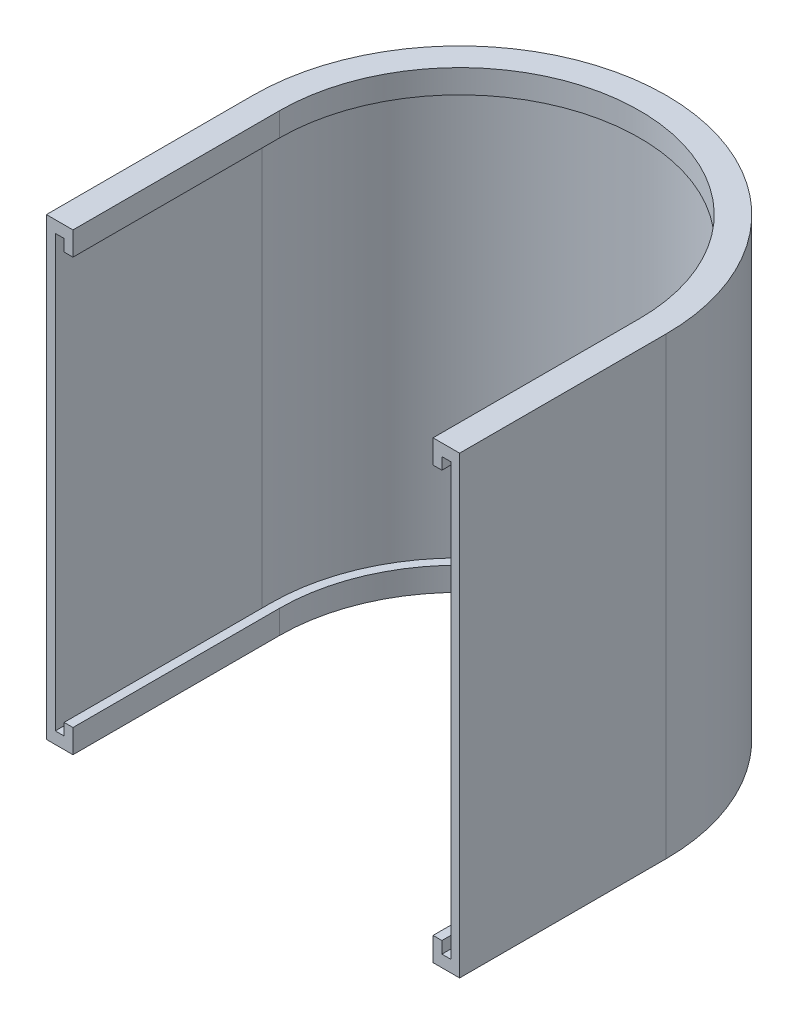
ISO-10303-21;
HEADER;
FILE_DESCRIPTION(('STEP AP214'),'2;1');
FILE_NAME('part.step','',(''),(''),'','','');
FILE_SCHEMA(('AUTOMOTIVE_DESIGN { 1 0 10303 214 1 1 1 1 }'));
ENDSEC;
DATA;
#1=APPLICATION_CONTEXT('core data for automotive mechanical design processes');
#2=APPLICATION_PROTOCOL_DEFINITION('international standard','automotive_design',2000,#1);
#3=PRODUCT_CONTEXT('',#1,'mechanical');
#4=PRODUCT('Part','Part','',(#3));
#5=PRODUCT_RELATED_PRODUCT_CATEGORY('part','',(#4));
#6=PRODUCT_DEFINITION_FORMATION('','',#4);
#7=PRODUCT_DEFINITION_CONTEXT('part definition',#1,'design');
#8=PRODUCT_DEFINITION('design','',#6,#7);
#9=PRODUCT_DEFINITION_SHAPE('','',#8);
#10=(LENGTH_UNIT() NAMED_UNIT(*) SI_UNIT(.MILLI.,.METRE.));
#11=(NAMED_UNIT(*) PLANE_ANGLE_UNIT() SI_UNIT($,.RADIAN.));
#12=(NAMED_UNIT(*) SI_UNIT($,.STERADIAN.) SOLID_ANGLE_UNIT());
#13=UNCERTAINTY_MEASURE_WITH_UNIT(LENGTH_MEASURE(1.E-05),#10,'distance_accuracy_value','');
#14=(GEOMETRIC_REPRESENTATION_CONTEXT(3) GLOBAL_UNCERTAINTY_ASSIGNED_CONTEXT((#13)) GLOBAL_UNIT_ASSIGNED_CONTEXT((#10,
#11,#12)) REPRESENTATION_CONTEXT('',''));
#15=CARTESIAN_POINT('',(0.,0.,0.));
#16=DIRECTION('',(0.,0.,1.));
#17=DIRECTION('',(1.,0.,0.));
#18=AXIS2_PLACEMENT_3D('',#15,#16,#17);
#19=CARTESIAN_POINT('',(-35.,2.,35.));
#20=DIRECTION('',(0.,0.,-1.));
#21=DIRECTION('',(-1.,0.,0.));
#22=AXIS2_PLACEMENT_3D('',#19,#20,#21);
#23=PLANE('',#22);
#24=DIRECTION('',(1.,0.,0.));
#25=VECTOR('',#24,1.);
#26=CARTESIAN_POINT('',(-35.,0.,35.));
#27=LINE('',#26,#25);
#28=CARTESIAN_POINT('',(-35.,0.,35.));
#29=VERTEX_POINT('',#28);
#30=CARTESIAN_POINT('',(-30.5,0.,35.));
#31=VERTEX_POINT('',#30);
#32=EDGE_CURVE('E373',#29,#31,#27,.T.);
#33=ORIENTED_EDGE('',*,*,#32,.T.);
#34=DIRECTION('',(0.,-1.,0.));
#35=VECTOR('',#34,1.);
#36=CARTESIAN_POINT('',(-30.5,4.,35.));
#37=LINE('',#36,#35);
#38=CARTESIAN_POINT('',(-30.5,4.,35.));
#39=VERTEX_POINT('',#38);
#40=EDGE_CURVE('E317',#39,#31,#37,.T.);
#41=ORIENTED_EDGE('',*,*,#40,.F.);
#42=DIRECTION('',(1.,0.,0.));
#43=VECTOR('',#42,1.);
#44=CARTESIAN_POINT('',(-32.,4.,35.));
#45=LINE('',#44,#43);
#46=CARTESIAN_POINT('',(-32.,4.,35.));
#47=VERTEX_POINT('',#46);
#48=EDGE_CURVE('E304',#47,#39,#45,.T.);
#49=ORIENTED_EDGE('',*,*,#48,.F.);
#50=DIRECTION('',(0.,-1.,0.));
#51=VECTOR('',#50,1.);
#52=CARTESIAN_POINT('',(-32.,4.,35.));
#53=LINE('',#52,#51);
#54=CARTESIAN_POINT('',(-32.,2.,35.));
#55=VERTEX_POINT('',#54);
#56=EDGE_CURVE('E319',#47,#55,#53,.T.);
#57=ORIENTED_EDGE('',*,*,#56,.T.);
#58=DIRECTION('',(1.,0.,0.));
#59=VECTOR('',#58,1.);
#60=CARTESIAN_POINT('',(-35.,2.,35.));
#61=LINE('',#60,#59);
#62=CARTESIAN_POINT('',(-33.5,2.,35.));
#63=VERTEX_POINT('',#62);
#64=EDGE_CURVE('E363',#63,#55,#61,.T.);
#65=ORIENTED_EDGE('',*,*,#64,.F.);
#66=DIRECTION('',(0.,-1.,0.));
#67=VECTOR('',#66,1.);
#68=CARTESIAN_POINT('',(-33.5,75.,35.));
#69=LINE('',#68,#67);
#70=CARTESIAN_POINT('',(-33.5,75.,35.));
#71=VERTEX_POINT('',#70);
#72=EDGE_CURVE('E353',#71,#63,#69,.T.);
#73=ORIENTED_EDGE('',*,*,#72,.F.);
#74=DIRECTION('',(1.,0.,0.));
#75=VECTOR('',#74,1.);
#76=CARTESIAN_POINT('',(-35.,75.,35.));
#77=LINE('',#76,#75);
#78=CARTESIAN_POINT('',(-32.,75.,35.));
#79=VERTEX_POINT('',#78);
#80=EDGE_CURVE('E280',#71,#79,#77,.T.);
#81=ORIENTED_EDGE('',*,*,#80,.T.);
#82=DIRECTION('',(0.,1.,0.));
#83=VECTOR('',#82,1.);
#84=CARTESIAN_POINT('',(-32.,73.,35.));
#85=LINE('',#84,#83);
#86=CARTESIAN_POINT('',(-32.,73.,35.));
#87=VERTEX_POINT('',#86);
#88=EDGE_CURVE('E262',#87,#79,#85,.T.);
#89=ORIENTED_EDGE('',*,*,#88,.F.);
#90=DIRECTION('',(-1.,0.,0.));
#91=VECTOR('',#90,1.);
#92=CARTESIAN_POINT('',(-32.,73.,35.));
#93=LINE('',#92,#91);
#94=CARTESIAN_POINT('',(-30.5,73.,35.));
#95=VERTEX_POINT('',#94);
#96=EDGE_CURVE('E248',#95,#87,#93,.T.);
#97=ORIENTED_EDGE('',*,*,#96,.F.);
#98=DIRECTION('',(0.,1.,0.));
#99=VECTOR('',#98,1.);
#100=CARTESIAN_POINT('',(-30.5,73.,35.));
#101=LINE('',#100,#99);
#102=CARTESIAN_POINT('',(-30.5,77.,35.));
#103=VERTEX_POINT('',#102);
#104=EDGE_CURVE('E265',#95,#103,#101,.T.);
#105=ORIENTED_EDGE('',*,*,#104,.T.);
#106=DIRECTION('',(1.,0.,0.));
#107=VECTOR('',#106,1.);
#108=CARTESIAN_POINT('',(-35.,77.,35.));
#109=LINE('',#108,#107);
#110=CARTESIAN_POINT('',(-35.,77.,35.));
#111=VERTEX_POINT('',#110);
#112=EDGE_CURVE('E284',#111,#103,#109,.T.);
#113=ORIENTED_EDGE('',*,*,#112,.F.);
#114=DIRECTION('',(0.,-1.,0.));
#115=VECTOR('',#114,1.);
#116=CARTESIAN_POINT('',(-35.,2.,35.));
#117=LINE('',#116,#115);
#118=EDGE_CURVE('E46',#111,#29,#117,.T.);
#119=ORIENTED_EDGE('',*,*,#118,.T.);
#120=EDGE_LOOP('',(#33,#41,#49,#57,#65,#73,#81,#89,#97,#105,#113,#119));
#121=FACE_BOUND('',#120,.T.);
#122=ADVANCED_FACE('F38',(#121),#23,.F.);
#123=CARTESIAN_POINT('',(0.,75.,0.));
#124=DIRECTION('',(0.,1.,0.));
#125=DIRECTION('',(0.,0.,1.));
#126=AXIS2_PLACEMENT_3D('',#123,#124,#125);
#127=PLANE('',#126);
#128=DIRECTION('',(0.,0.,1.));
#129=VECTOR('',#128,1.);
#130=CARTESIAN_POINT('',(32.,75.,0.));
#131=LINE('',#130,#129);
#132=CARTESIAN_POINT('',(32.,75.,0.));
#133=VERTEX_POINT('',#132);
#134=CARTESIAN_POINT('',(32.,75.,35.));
#135=VERTEX_POINT('',#134);
#136=EDGE_CURVE('E255',#133,#135,#131,.T.);
#137=ORIENTED_EDGE('',*,*,#136,.F.);
#138=CARTESIAN_POINT('',(0.,75.,0.));
#139=DIRECTION('',(0.,-1.,0.));
#140=DIRECTION('',(0.,0.,-1.));
#141=AXIS2_PLACEMENT_3D('',#138,#139,#140);
#142=CIRCLE('',#141,32.);
#143=CARTESIAN_POINT('',(-32.,75.,0.));
#144=VERTEX_POINT('',#143);
#145=EDGE_CURVE('E234',#144,#133,#142,.T.);
#146=ORIENTED_EDGE('',*,*,#145,.F.);
#147=DIRECTION('',(0.,0.,-1.));
#148=VECTOR('',#147,1.);
#149=CARTESIAN_POINT('',(-32.,75.,0.));
#150=LINE('',#149,#148);
#151=EDGE_CURVE('E239',#79,#144,#150,.T.);
#152=ORIENTED_EDGE('',*,*,#151,.F.);
#153=ORIENTED_EDGE('',*,*,#80,.F.);
#154=DIRECTION('',(0.,0.,-1.));
#155=VECTOR('',#154,1.);
#156=CARTESIAN_POINT('',(-33.5,75.,0.));
#157=LINE('',#156,#155);
#158=CARTESIAN_POINT('',(-33.5,75.,0.));
#159=VERTEX_POINT('',#158);
#160=EDGE_CURVE('E340',#71,#159,#157,.T.);
#161=ORIENTED_EDGE('',*,*,#160,.T.);
#162=CARTESIAN_POINT('',(0.,75.,0.));
#163=DIRECTION('',(0.,-1.,0.));
#164=DIRECTION('',(0.,0.,1.));
#165=AXIS2_PLACEMENT_3D('',#162,#163,#164);
#166=CIRCLE('',#165,33.5);
#167=CARTESIAN_POINT('',(33.5,75.,0.));
#168=VERTEX_POINT('',#167);
#169=EDGE_CURVE('E333',#159,#168,#166,.T.);
#170=ORIENTED_EDGE('',*,*,#169,.T.);
#171=DIRECTION('',(0.,0.,1.));
#172=VECTOR('',#171,1.);
#173=CARTESIAN_POINT('',(33.5,75.,0.));
#174=LINE('',#173,#172);
#175=CARTESIAN_POINT('',(33.5,75.,35.));
#176=VERTEX_POINT('',#175);
#177=EDGE_CURVE('E336',#168,#176,#174,.T.);
#178=ORIENTED_EDGE('',*,*,#177,.T.);
#179=EDGE_CURVE('E275',#135,#176,#77,.T.);
#180=ORIENTED_EDGE('',*,*,#179,.F.);
#181=EDGE_LOOP('',(#137,#146,#152,#153,#161,#170,#178,#180));
#182=FACE_BOUND('',#181,.T.);
#183=ADVANCED_FACE('F419',(#182),#127,.F.);
#184=CARTESIAN_POINT('',(0.,2.,0.));
#185=DIRECTION('',(0.,1.,0.));
#186=DIRECTION('',(0.,0.,1.));
#187=AXIS2_PLACEMENT_3D('',#184,#185,#186);
#188=PLANE('',#187);
#189=CARTESIAN_POINT('',(0.,2.,0.));
#190=DIRECTION('',(0.,1.,0.));
#191=DIRECTION('',(0.,0.,1.));
#192=AXIS2_PLACEMENT_3D('',#189,#190,#191);
#193=CIRCLE('',#192,32.);
#194=CARTESIAN_POINT('',(32.,2.,0.));
#195=VERTEX_POINT('',#194);
#196=CARTESIAN_POINT('',(-32.,2.,0.));
#197=VERTEX_POINT('',#196);
#198=EDGE_CURVE('E311',#195,#197,#193,.T.);
#199=ORIENTED_EDGE('',*,*,#198,.F.);
#200=DIRECTION('',(0.,0.,-1.));
#201=VECTOR('',#200,1.);
#202=CARTESIAN_POINT('',(32.,2.,0.));
#203=LINE('',#202,#201);
#204=CARTESIAN_POINT('',(32.,2.,35.));
#205=VERTEX_POINT('',#204);
#206=EDGE_CURVE('E289',#205,#195,#203,.T.);
#207=ORIENTED_EDGE('',*,*,#206,.F.);
#208=CARTESIAN_POINT('',(33.5,2.,35.));
#209=VERTEX_POINT('',#208);
#210=EDGE_CURVE('E367',#205,#209,#61,.T.);
#211=ORIENTED_EDGE('',*,*,#210,.T.);
#212=DIRECTION('',(0.,0.,1.));
#213=VECTOR('',#212,1.);
#214=CARTESIAN_POINT('',(33.5,2.,0.));
#215=LINE('',#214,#213);
#216=CARTESIAN_POINT('',(33.5,2.,0.));
#217=VERTEX_POINT('',#216);
#218=EDGE_CURVE('E346',#217,#209,#215,.T.);
#219=ORIENTED_EDGE('',*,*,#218,.F.);
#220=CARTESIAN_POINT('',(0.,2.,0.));
#221=DIRECTION('',(0.,-1.,0.));
#222=DIRECTION('',(0.,0.,1.));
#223=AXIS2_PLACEMENT_3D('',#220,#221,#222);
#224=CIRCLE('',#223,33.5);
#225=CARTESIAN_POINT('',(-33.5,2.,0.));
#226=VERTEX_POINT('',#225);
#227=EDGE_CURVE('E332',#226,#217,#224,.T.);
#228=ORIENTED_EDGE('',*,*,#227,.F.);
#229=DIRECTION('',(0.,0.,-1.));
#230=VECTOR('',#229,1.);
#231=CARTESIAN_POINT('',(-33.5,2.,0.));
#232=LINE('',#231,#230);
#233=EDGE_CURVE('E337',#63,#226,#232,.T.);
#234=ORIENTED_EDGE('',*,*,#233,.F.);
#235=ORIENTED_EDGE('',*,*,#64,.T.);
#236=DIRECTION('',(0.,0.,1.));
#237=VECTOR('',#236,1.);
#238=CARTESIAN_POINT('',(-32.,2.,0.));
#239=LINE('',#238,#237);
#240=EDGE_CURVE('E296',#197,#55,#239,.T.);
#241=ORIENTED_EDGE('',*,*,#240,.F.);
#242=EDGE_LOOP('',(#199,#207,#211,#219,#228,#234,#235,#241));
#243=FACE_BOUND('',#242,.T.);
#244=ADVANCED_FACE('F411',(#243),#188,.T.);
#245=CARTESIAN_POINT('',(0.,2.,0.));
#246=DIRECTION('',(0.,-1.,0.));
#247=DIRECTION('',(0.,0.,-1.));
#248=AXIS2_PLACEMENT_3D('',#245,#246,#247);
#249=CYLINDRICAL_SURFACE('',#248,35.);
#250=CARTESIAN_POINT('',(0.,0.,0.));
#251=DIRECTION('',(0.,1.,0.));
#252=DIRECTION('',(0.,0.,1.));
#253=AXIS2_PLACEMENT_3D('',#250,#251,#252);
#254=CIRCLE('',#253,35.);
#255=CARTESIAN_POINT('',(35.,0.,0.));
#256=VERTEX_POINT('',#255);
#257=CARTESIAN_POINT('',(-35.,0.,0.));
#258=VERTEX_POINT('',#257);
#259=EDGE_CURVE('E362',#256,#258,#254,.T.);
#260=ORIENTED_EDGE('',*,*,#259,.T.);
#261=DIRECTION('',(0.,-1.,0.));
#262=VECTOR('',#261,1.);
#263=CARTESIAN_POINT('',(-35.,2.,0.));
#264=LINE('',#263,#262);
#265=CARTESIAN_POINT('',(-35.,77.,0.));
#266=VERTEX_POINT('',#265);
#267=EDGE_CURVE('E11',#266,#258,#264,.T.);
#268=ORIENTED_EDGE('',*,*,#267,.F.);
#269=CARTESIAN_POINT('',(0.,77.,0.));
#270=DIRECTION('',(0.,1.,0.));
#271=DIRECTION('',(0.,0.,1.));
#272=AXIS2_PLACEMENT_3D('',#269,#270,#271);
#273=CIRCLE('',#272,35.);
#274=CARTESIAN_POINT('',(35.,77.,0.));
#275=VERTEX_POINT('',#274);
#276=EDGE_CURVE('E276',#275,#266,#273,.T.);
#277=ORIENTED_EDGE('',*,*,#276,.F.);
#278=DIRECTION('',(0.,-1.,0.));
#279=VECTOR('',#278,1.);
#280=CARTESIAN_POINT('',(35.,2.,0.));
#281=LINE('',#280,#279);
#282=EDGE_CURVE('E366',#275,#256,#281,.T.);
#283=ORIENTED_EDGE('',*,*,#282,.T.);
#284=EDGE_LOOP('',(#260,#268,#277,#283));
#285=FACE_BOUND('',#284,.T.);
#286=ADVANCED_FACE('F40',(#285),#249,.T.);
#287=CARTESIAN_POINT('',(-35.,2.,0.));
#288=DIRECTION('',(1.,0.,0.));
#289=DIRECTION('',(0.,0.,-1.));
#290=AXIS2_PLACEMENT_3D('',#287,#288,#289);
#291=PLANE('',#290);
#292=DIRECTION('',(0.,0.,1.));
#293=VECTOR('',#292,1.);
#294=CARTESIAN_POINT('',(-35.,0.,0.));
#295=LINE('',#294,#293);
#296=EDGE_CURVE('E370',#258,#29,#295,.T.);
#297=ORIENTED_EDGE('',*,*,#296,.T.);
#298=ORIENTED_EDGE('',*,*,#118,.F.);
#299=DIRECTION('',(0.,0.,1.));
#300=VECTOR('',#299,1.);
#301=CARTESIAN_POINT('',(-35.,77.,0.));
#302=LINE('',#301,#300);
#303=EDGE_CURVE('E279',#266,#111,#302,.T.);
#304=ORIENTED_EDGE('',*,*,#303,.F.);
#305=ORIENTED_EDGE('',*,*,#267,.T.);
#306=EDGE_LOOP('',(#297,#298,#304,#305));
#307=FACE_BOUND('',#306,.T.);
#308=ADVANCED_FACE('F435',(#307),#291,.F.);
#309=CARTESIAN_POINT('',(30.5,77.,35.));
#310=VERTEX_POINT('',#309);
#311=CARTESIAN_POINT('',(35.,77.,35.));
#312=VERTEX_POINT('',#311);
#313=EDGE_CURVE('E283',#310,#312,#109,.T.);
#314=ORIENTED_EDGE('',*,*,#313,.F.);
#315=DIRECTION('',(0.,1.,0.));
#316=VECTOR('',#315,1.);
#317=CARTESIAN_POINT('',(30.5,73.,35.));
#318=LINE('',#317,#316);
#319=CARTESIAN_POINT('',(30.5,73.,35.));
#320=VERTEX_POINT('',#319);
#321=EDGE_CURVE('E61',#320,#310,#318,.T.);
#322=ORIENTED_EDGE('',*,*,#321,.F.);
#323=DIRECTION('',(-1.,0.,0.));
#324=VECTOR('',#323,1.);
#325=CARTESIAN_POINT('',(30.5,73.,35.));
#326=LINE('',#325,#324);
#327=CARTESIAN_POINT('',(32.,73.,35.));
#328=VERTEX_POINT('',#327);
#329=EDGE_CURVE('E241',#328,#320,#326,.T.);
#330=ORIENTED_EDGE('',*,*,#329,.F.);
#331=DIRECTION('',(0.,1.,0.));
#332=VECTOR('',#331,1.);
#333=CARTESIAN_POINT('',(32.,73.,35.));
#334=LINE('',#333,#332);
#335=EDGE_CURVE('E269',#328,#135,#334,.T.);
#336=ORIENTED_EDGE('',*,*,#335,.T.);
#337=ORIENTED_EDGE('',*,*,#179,.T.);
#338=DIRECTION('',(0.,-1.,0.));
#339=VECTOR('',#338,1.);
#340=CARTESIAN_POINT('',(33.5,75.,35.));
#341=LINE('',#340,#339);
#342=EDGE_CURVE('E356',#176,#209,#341,.T.);
#343=ORIENTED_EDGE('',*,*,#342,.T.);
#344=ORIENTED_EDGE('',*,*,#210,.F.);
#345=DIRECTION('',(0.,-1.,0.));
#346=VECTOR('',#345,1.);
#347=CARTESIAN_POINT('',(32.,4.,35.));
#348=LINE('',#347,#346);
#349=CARTESIAN_POINT('',(32.,4.,35.));
#350=VERTEX_POINT('',#349);
#351=EDGE_CURVE('E328',#350,#205,#348,.T.);
#352=ORIENTED_EDGE('',*,*,#351,.F.);
#353=DIRECTION('',(1.,0.,0.));
#354=VECTOR('',#353,1.);
#355=CARTESIAN_POINT('',(30.5,4.,35.));
#356=LINE('',#355,#354);
#357=CARTESIAN_POINT('',(30.5,4.,35.));
#358=VERTEX_POINT('',#357);
#359=EDGE_CURVE('E295',#358,#350,#356,.T.);
#360=ORIENTED_EDGE('',*,*,#359,.F.);
#361=DIRECTION('',(0.,-1.,0.));
#362=VECTOR('',#361,1.);
#363=CARTESIAN_POINT('',(30.5,4.,35.));
#364=LINE('',#363,#362);
#365=CARTESIAN_POINT('',(30.5,0.,35.));
#366=VERTEX_POINT('',#365);
#367=EDGE_CURVE('E330',#358,#366,#364,.T.);
#368=ORIENTED_EDGE('',*,*,#367,.T.);
#369=CARTESIAN_POINT('',(35.,0.,35.));
#370=VERTEX_POINT('',#369);
#371=EDGE_CURVE('E372',#366,#370,#27,.T.);
#372=ORIENTED_EDGE('',*,*,#371,.T.);
#373=DIRECTION('',(0.,-1.,0.));
#374=VECTOR('',#373,1.);
#375=CARTESIAN_POINT('',(35.,2.,35.));
#376=LINE('',#375,#374);
#377=EDGE_CURVE('E380',#312,#370,#376,.T.);
#378=ORIENTED_EDGE('',*,*,#377,.F.);
#379=EDGE_LOOP('',(#314,#322,#330,#336,#337,#343,#344,#352,#360,#368,#372,#378));
#380=FACE_BOUND('',#379,.T.);
#381=ADVANCED_FACE('F444',(#380),#23,.F.);
#382=CARTESIAN_POINT('',(35.,2.,0.));
#383=DIRECTION('',(-1.,0.,0.));
#384=DIRECTION('',(0.,0.,1.));
#385=AXIS2_PLACEMENT_3D('',#382,#383,#384);
#386=PLANE('',#385);
#387=DIRECTION('',(0.,0.,-1.));
#388=VECTOR('',#387,1.);
#389=CARTESIAN_POINT('',(35.,0.,0.));
#390=LINE('',#389,#388);
#391=EDGE_CURVE('E376',#370,#256,#390,.T.);
#392=ORIENTED_EDGE('',*,*,#391,.T.);
#393=ORIENTED_EDGE('',*,*,#282,.F.);
#394=DIRECTION('',(0.,0.,-1.));
#395=VECTOR('',#394,1.);
#396=CARTESIAN_POINT('',(35.,77.,0.));
#397=LINE('',#396,#395);
#398=EDGE_CURVE('E286',#312,#275,#397,.T.);
#399=ORIENTED_EDGE('',*,*,#398,.F.);
#400=ORIENTED_EDGE('',*,*,#377,.T.);
#401=EDGE_LOOP('',(#392,#393,#399,#400));
#402=FACE_BOUND('',#401,.T.);
#403=ADVANCED_FACE('F440',(#402),#386,.F.);
#404=CARTESIAN_POINT('',(0.,0.,0.));
#405=DIRECTION('',(0.,1.,0.));
#406=DIRECTION('',(0.,0.,1.));
#407=AXIS2_PLACEMENT_3D('',#404,#405,#406);
#408=PLANE('',#407);
#409=CARTESIAN_POINT('',(0.,0.,0.));
#410=DIRECTION('',(0.,1.,0.));
#411=DIRECTION('',(0.,0.,1.));
#412=AXIS2_PLACEMENT_3D('',#409,#410,#411);
#413=CIRCLE('',#412,30.5);
#414=CARTESIAN_POINT('',(30.5,0.,0.));
#415=VERTEX_POINT('',#414);
#416=CARTESIAN_POINT('',(-30.5,0.,0.));
#417=VERTEX_POINT('',#416);
#418=EDGE_CURVE('E228',#415,#417,#413,.T.);
#419=ORIENTED_EDGE('',*,*,#418,.T.);
#420=DIRECTION('',(0.,0.,1.));
#421=VECTOR('',#420,1.);
#422=CARTESIAN_POINT('',(-30.5,0.,0.));
#423=LINE('',#422,#421);
#424=EDGE_CURVE('E231',#417,#31,#423,.T.);
#425=ORIENTED_EDGE('',*,*,#424,.T.);
#426=ORIENTED_EDGE('',*,*,#32,.F.);
#427=ORIENTED_EDGE('',*,*,#296,.F.);
#428=ORIENTED_EDGE('',*,*,#259,.F.);
#429=ORIENTED_EDGE('',*,*,#391,.F.);
#430=ORIENTED_EDGE('',*,*,#371,.F.);
#431=DIRECTION('',(0.,0.,-1.));
#432=VECTOR('',#431,1.);
#433=CARTESIAN_POINT('',(30.5,0.,0.));
#434=LINE('',#433,#432);
#435=EDGE_CURVE('E223',#366,#415,#434,.T.);
#436=ORIENTED_EDGE('',*,*,#435,.T.);
#437=EDGE_LOOP('',(#419,#425,#426,#427,#428,#429,#430,#436));
#438=FACE_BOUND('',#437,.T.);
#439=ADVANCED_FACE('F390',(#438),#408,.F.);
#440=CARTESIAN_POINT('',(0.,75.,0.));
#441=DIRECTION('',(0.,-1.,0.));
#442=DIRECTION('',(0.,0.,-1.));
#443=AXIS2_PLACEMENT_3D('',#440,#441,#442);
#444=CYLINDRICAL_SURFACE('',#443,33.5);
#445=ORIENTED_EDGE('',*,*,#227,.T.);
#446=DIRECTION('',(0.,-1.,0.));
#447=VECTOR('',#446,1.);
#448=CARTESIAN_POINT('',(33.5,75.,0.));
#449=LINE('',#448,#447);
#450=EDGE_CURVE('E359',#168,#217,#449,.T.);
#451=ORIENTED_EDGE('',*,*,#450,.F.);
#452=ORIENTED_EDGE('',*,*,#169,.F.);
#453=DIRECTION('',(0.,-1.,0.));
#454=VECTOR('',#453,1.);
#455=CARTESIAN_POINT('',(-33.5,75.,0.));
#456=LINE('',#455,#454);
#457=EDGE_CURVE('E343',#159,#226,#456,.T.);
#458=ORIENTED_EDGE('',*,*,#457,.T.);
#459=EDGE_LOOP('',(#445,#451,#452,#458));
#460=FACE_BOUND('',#459,.T.);
#461=ADVANCED_FACE('F483',(#460),#444,.F.);
#462=CARTESIAN_POINT('',(33.5,75.,0.));
#463=DIRECTION('',(1.,0.,0.));
#464=DIRECTION('',(0.,0.,-1.));
#465=AXIS2_PLACEMENT_3D('',#462,#463,#464);
#466=PLANE('',#465);
#467=ORIENTED_EDGE('',*,*,#218,.T.);
#468=ORIENTED_EDGE('',*,*,#342,.F.);
#469=ORIENTED_EDGE('',*,*,#177,.F.);
#470=ORIENTED_EDGE('',*,*,#450,.T.);
#471=EDGE_LOOP('',(#467,#468,#469,#470));
#472=FACE_BOUND('',#471,.T.);
#473=ADVANCED_FACE('F458',(#472),#466,.F.);
#474=CARTESIAN_POINT('',(-33.5,75.,0.));
#475=DIRECTION('',(-1.,0.,0.));
#476=DIRECTION('',(0.,0.,1.));
#477=AXIS2_PLACEMENT_3D('',#474,#475,#476);
#478=PLANE('',#477);
#479=ORIENTED_EDGE('',*,*,#233,.T.);
#480=ORIENTED_EDGE('',*,*,#457,.F.);
#481=ORIENTED_EDGE('',*,*,#160,.F.);
#482=ORIENTED_EDGE('',*,*,#72,.T.);
#483=EDGE_LOOP('',(#479,#480,#481,#482));
#484=FACE_BOUND('',#483,.T.);
#485=ADVANCED_FACE('F415',(#484),#478,.F.);
#486=CARTESIAN_POINT('',(30.5,4.,0.));
#487=DIRECTION('',(1.,0.,0.));
#488=DIRECTION('',(0.,0.,-1.));
#489=AXIS2_PLACEMENT_3D('',#486,#487,#488);
#490=PLANE('',#489);
#491=DIRECTION('',(0.,-1.,0.));
#492=VECTOR('',#491,1.);
#493=CARTESIAN_POINT('',(30.5,4.,0.));
#494=LINE('',#493,#492);
#495=CARTESIAN_POINT('',(30.5,4.,0.));
#496=VERTEX_POINT('',#495);
#497=EDGE_CURVE('E53',#496,#415,#494,.T.);
#498=ORIENTED_EDGE('',*,*,#497,.T.);
#499=ORIENTED_EDGE('',*,*,#435,.F.);
#500=ORIENTED_EDGE('',*,*,#367,.F.);
#501=DIRECTION('',(0.,0.,1.));
#502=VECTOR('',#501,1.);
#503=CARTESIAN_POINT('',(30.5,4.,0.));
#504=LINE('',#503,#502);
#505=EDGE_CURVE('E292',#496,#358,#504,.T.);
#506=ORIENTED_EDGE('',*,*,#505,.F.);
#507=EDGE_LOOP('',(#498,#499,#500,#506));
#508=FACE_BOUND('',#507,.T.);
#509=ADVANCED_FACE('F447',(#508),#490,.F.);
#510=CARTESIAN_POINT('',(32.,4.,0.));
#511=DIRECTION('',(-1.,0.,0.));
#512=DIRECTION('',(0.,0.,1.));
#513=AXIS2_PLACEMENT_3D('',#510,#511,#512);
#514=PLANE('',#513);
#515=ORIENTED_EDGE('',*,*,#206,.T.);
#516=DIRECTION('',(0.,-1.,0.));
#517=VECTOR('',#516,1.);
#518=CARTESIAN_POINT('',(32.,4.,0.));
#519=LINE('',#518,#517);
#520=CARTESIAN_POINT('',(32.,4.,0.));
#521=VERTEX_POINT('',#520);
#522=EDGE_CURVE('E325',#521,#195,#519,.T.);
#523=ORIENTED_EDGE('',*,*,#522,.F.);
#524=DIRECTION('',(0.,0.,-1.));
#525=VECTOR('',#524,1.);
#526=CARTESIAN_POINT('',(32.,4.,0.));
#527=LINE('',#526,#525);
#528=EDGE_CURVE('E298',#350,#521,#527,.T.);
#529=ORIENTED_EDGE('',*,*,#528,.F.);
#530=ORIENTED_EDGE('',*,*,#351,.T.);
#531=EDGE_LOOP('',(#515,#523,#529,#530));
#532=FACE_BOUND('',#531,.T.);
#533=ADVANCED_FACE('F449',(#532),#514,.F.);
#534=CARTESIAN_POINT('',(0.,4.,0.));
#535=DIRECTION('',(0.,-1.,0.));
#536=DIRECTION('',(0.,0.,-1.));
#537=AXIS2_PLACEMENT_3D('',#534,#535,#536);
#538=CYLINDRICAL_SURFACE('',#537,32.);
#539=ORIENTED_EDGE('',*,*,#198,.T.);
#540=DIRECTION('',(0.,-1.,0.));
#541=VECTOR('',#540,1.);
#542=CARTESIAN_POINT('',(-32.,4.,0.));
#543=LINE('',#542,#541);
#544=CARTESIAN_POINT('',(-32.,4.,0.));
#545=VERTEX_POINT('',#544);
#546=EDGE_CURVE('E322',#545,#197,#543,.T.);
#547=ORIENTED_EDGE('',*,*,#546,.F.);
#548=CARTESIAN_POINT('',(0.,4.,0.));
#549=DIRECTION('',(0.,1.,0.));
#550=DIRECTION('',(0.,0.,1.));
#551=AXIS2_PLACEMENT_3D('',#548,#549,#550);
#552=CIRCLE('',#551,32.);
#553=EDGE_CURVE('E300',#521,#545,#552,.T.);
#554=ORIENTED_EDGE('',*,*,#553,.F.);
#555=ORIENTED_EDGE('',*,*,#522,.T.);
#556=EDGE_LOOP('',(#539,#547,#554,#555));
#557=FACE_BOUND('',#556,.T.);
#558=ADVANCED_FACE('F455',(#557),#538,.T.);
#559=CARTESIAN_POINT('',(-32.,4.,0.));
#560=DIRECTION('',(1.,0.,0.));
#561=DIRECTION('',(0.,0.,-1.));
#562=AXIS2_PLACEMENT_3D('',#559,#560,#561);
#563=PLANE('',#562);
#564=ORIENTED_EDGE('',*,*,#240,.T.);
#565=ORIENTED_EDGE('',*,*,#56,.F.);
#566=DIRECTION('',(0.,0.,1.));
#567=VECTOR('',#566,1.);
#568=CARTESIAN_POINT('',(-32.,4.,0.));
#569=LINE('',#568,#567);
#570=EDGE_CURVE('E302',#545,#47,#569,.T.);
#571=ORIENTED_EDGE('',*,*,#570,.F.);
#572=ORIENTED_EDGE('',*,*,#546,.T.);
#573=EDGE_LOOP('',(#564,#565,#571,#572));
#574=FACE_BOUND('',#573,.T.);
#575=ADVANCED_FACE('F407',(#574),#563,.F.);
#576=CARTESIAN_POINT('',(-30.5,4.,0.));
#577=DIRECTION('',(-1.,0.,0.));
#578=DIRECTION('',(0.,0.,1.));
#579=AXIS2_PLACEMENT_3D('',#576,#577,#578);
#580=PLANE('',#579);
#581=ORIENTED_EDGE('',*,*,#40,.T.);
#582=ORIENTED_EDGE('',*,*,#424,.F.);
#583=DIRECTION('',(0.,-1.,0.));
#584=VECTOR('',#583,1.);
#585=CARTESIAN_POINT('',(-30.5,4.,0.));
#586=LINE('',#585,#584);
#587=CARTESIAN_POINT('',(-30.5,4.,0.));
#588=VERTEX_POINT('',#587);
#589=EDGE_CURVE('E315',#588,#417,#586,.T.);
#590=ORIENTED_EDGE('',*,*,#589,.F.);
#591=DIRECTION('',(0.,0.,-1.));
#592=VECTOR('',#591,1.);
#593=CARTESIAN_POINT('',(-30.5,4.,0.));
#594=LINE('',#593,#592);
#595=EDGE_CURVE('E306',#39,#588,#594,.T.);
#596=ORIENTED_EDGE('',*,*,#595,.F.);
#597=EDGE_LOOP('',(#581,#582,#590,#596));
#598=FACE_BOUND('',#597,.T.);
#599=ADVANCED_FACE('F395',(#598),#580,.F.);
#600=CARTESIAN_POINT('',(0.,4.,0.));
#601=DIRECTION('',(0.,-1.,0.));
#602=DIRECTION('',(0.,0.,-1.));
#603=AXIS2_PLACEMENT_3D('',#600,#601,#602);
#604=CYLINDRICAL_SURFACE('',#603,30.5);
#605=ORIENTED_EDGE('',*,*,#589,.T.);
#606=ORIENTED_EDGE('',*,*,#418,.F.);
#607=ORIENTED_EDGE('',*,*,#497,.F.);
#608=CARTESIAN_POINT('',(0.,4.,0.));
#609=DIRECTION('',(0.,-1.,0.));
#610=DIRECTION('',(0.,0.,1.));
#611=AXIS2_PLACEMENT_3D('',#608,#609,#610);
#612=CIRCLE('',#611,30.5);
#613=EDGE_CURVE('E308',#588,#496,#612,.T.);
#614=ORIENTED_EDGE('',*,*,#613,.F.);
#615=EDGE_LOOP('',(#605,#606,#607,#614));
#616=FACE_BOUND('',#615,.T.);
#617=ADVANCED_FACE('F515',(#616),#604,.F.);
#618=CARTESIAN_POINT('',(0.,4.,0.));
#619=DIRECTION('',(0.,1.,0.));
#620=DIRECTION('',(0.,0.,1.));
#621=AXIS2_PLACEMENT_3D('',#618,#619,#620);
#622=PLANE('',#621);
#623=ORIENTED_EDGE('',*,*,#505,.T.);
#624=ORIENTED_EDGE('',*,*,#359,.T.);
#625=ORIENTED_EDGE('',*,*,#528,.T.);
#626=ORIENTED_EDGE('',*,*,#553,.T.);
#627=ORIENTED_EDGE('',*,*,#570,.T.);
#628=ORIENTED_EDGE('',*,*,#48,.T.);
#629=ORIENTED_EDGE('',*,*,#595,.T.);
#630=ORIENTED_EDGE('',*,*,#613,.T.);
#631=EDGE_LOOP('',(#623,#624,#625,#626,#627,#628,#629,#630));
#632=FACE_BOUND('',#631,.T.);
#633=ADVANCED_FACE('F402',(#632),#622,.T.);
#634=CARTESIAN_POINT('',(0.,77.,0.));
#635=DIRECTION('',(0.,1.,0.));
#636=DIRECTION('',(0.,0.,1.));
#637=AXIS2_PLACEMENT_3D('',#634,#635,#636);
#638=PLANE('',#637);
#639=DIRECTION('',(0.,0.,1.));
#640=VECTOR('',#639,1.);
#641=CARTESIAN_POINT('',(-30.5,77.,30.5));
#642=LINE('',#641,#640);
#643=CARTESIAN_POINT('',(-30.5,77.,0.));
#644=VERTEX_POINT('',#643);
#645=EDGE_CURVE('E221',#644,#103,#642,.T.);
#646=ORIENTED_EDGE('',*,*,#645,.F.);
#647=CARTESIAN_POINT('',(0.,77.,0.));
#648=DIRECTION('',(0.,1.,0.));
#649=DIRECTION('',(0.,0.,1.));
#650=AXIS2_PLACEMENT_3D('',#647,#648,#649);
#651=CIRCLE('',#650,30.5);
#652=CARTESIAN_POINT('',(30.5,77.,0.));
#653=VERTEX_POINT('',#652);
#654=EDGE_CURVE('E208',#653,#644,#651,.T.);
#655=ORIENTED_EDGE('',*,*,#654,.F.);
#656=DIRECTION('',(0.,0.,-1.));
#657=VECTOR('',#656,1.);
#658=CARTESIAN_POINT('',(30.5,77.,30.5));
#659=LINE('',#658,#657);
#660=EDGE_CURVE('E213',#310,#653,#659,.T.);
#661=ORIENTED_EDGE('',*,*,#660,.F.);
#662=ORIENTED_EDGE('',*,*,#313,.T.);
#663=ORIENTED_EDGE('',*,*,#398,.T.);
#664=ORIENTED_EDGE('',*,*,#276,.T.);
#665=ORIENTED_EDGE('',*,*,#303,.T.);
#666=ORIENTED_EDGE('',*,*,#112,.T.);
#667=EDGE_LOOP('',(#646,#655,#661,#662,#663,#664,#665,#666));
#668=FACE_BOUND('',#667,.T.);
#669=ADVANCED_FACE('F218',(#668),#638,.T.);
#670=CARTESIAN_POINT('',(0.,73.,0.));
#671=DIRECTION('',(0.,1.,0.));
#672=DIRECTION('',(0.,0.,1.));
#673=AXIS2_PLACEMENT_3D('',#670,#671,#672);
#674=CYLINDRICAL_SURFACE('',#673,32.);
#675=ORIENTED_EDGE('',*,*,#145,.T.);
#676=DIRECTION('',(0.,1.,0.));
#677=VECTOR('',#676,1.);
#678=CARTESIAN_POINT('',(32.,73.,0.));
#679=LINE('',#678,#677);
#680=CARTESIAN_POINT('',(32.,73.,0.));
#681=VERTEX_POINT('',#680);
#682=EDGE_CURVE('E272',#681,#133,#679,.T.);
#683=ORIENTED_EDGE('',*,*,#682,.F.);
#684=CARTESIAN_POINT('',(0.,73.,0.));
#685=DIRECTION('',(0.,-1.,0.));
#686=DIRECTION('',(0.,0.,-1.));
#687=AXIS2_PLACEMENT_3D('',#684,#685,#686);
#688=CIRCLE('',#687,32.);
#689=CARTESIAN_POINT('',(-32.,73.,0.));
#690=VERTEX_POINT('',#689);
#691=EDGE_CURVE('E235',#690,#681,#688,.T.);
#692=ORIENTED_EDGE('',*,*,#691,.F.);
#693=DIRECTION('',(0.,1.,0.));
#694=VECTOR('',#693,1.);
#695=CARTESIAN_POINT('',(-32.,73.,0.));
#696=LINE('',#695,#694);
#697=EDGE_CURVE('E252',#690,#144,#696,.T.);
#698=ORIENTED_EDGE('',*,*,#697,.T.);
#699=EDGE_LOOP('',(#675,#683,#692,#698));
#700=FACE_BOUND('',#699,.T.);
#701=ADVANCED_FACE('F502',(#700),#674,.T.);
#702=CARTESIAN_POINT('',(32.,73.,0.));
#703=DIRECTION('',(-1.,0.,0.));
#704=DIRECTION('',(0.,0.,1.));
#705=AXIS2_PLACEMENT_3D('',#702,#703,#704);
#706=PLANE('',#705);
#707=ORIENTED_EDGE('',*,*,#136,.T.);
#708=ORIENTED_EDGE('',*,*,#335,.F.);
#709=DIRECTION('',(0.,0.,1.));
#710=VECTOR('',#709,1.);
#711=CARTESIAN_POINT('',(32.,73.,0.));
#712=LINE('',#711,#710);
#713=EDGE_CURVE('E238',#681,#328,#712,.T.);
#714=ORIENTED_EDGE('',*,*,#713,.F.);
#715=ORIENTED_EDGE('',*,*,#682,.T.);
#716=EDGE_LOOP('',(#707,#708,#714,#715));
#717=FACE_BOUND('',#716,.T.);
#718=ADVANCED_FACE('F499',(#717),#706,.F.);
#719=CARTESIAN_POINT('',(30.5,73.,0.));
#720=DIRECTION('',(1.,0.,0.));
#721=DIRECTION('',(0.,0.,-1.));
#722=AXIS2_PLACEMENT_3D('',#719,#720,#721);
#723=PLANE('',#722);
#724=ORIENTED_EDGE('',*,*,#321,.T.);
#725=ORIENTED_EDGE('',*,*,#660,.T.);
#726=DIRECTION('',(0.,1.,0.));
#727=VECTOR('',#726,1.);
#728=CARTESIAN_POINT('',(30.5,73.,0.));
#729=LINE('',#728,#727);
#730=CARTESIAN_POINT('',(30.5,73.,0.));
#731=VERTEX_POINT('',#730);
#732=EDGE_CURVE('E204',#731,#653,#729,.T.);
#733=ORIENTED_EDGE('',*,*,#732,.F.);
#734=DIRECTION('',(0.,0.,-1.));
#735=VECTOR('',#734,1.);
#736=CARTESIAN_POINT('',(30.5,73.,0.));
#737=LINE('',#736,#735);
#738=EDGE_CURVE('E243',#320,#731,#737,.T.);
#739=ORIENTED_EDGE('',*,*,#738,.F.);
#740=EDGE_LOOP('',(#724,#725,#733,#739));
#741=FACE_BOUND('',#740,.T.);
#742=ADVANCED_FACE('F214',(#741),#723,.F.);
#743=CARTESIAN_POINT('',(0.,73.,0.));
#744=DIRECTION('',(0.,1.,0.));
#745=DIRECTION('',(0.,0.,1.));
#746=AXIS2_PLACEMENT_3D('',#743,#744,#745);
#747=CYLINDRICAL_SURFACE('',#746,30.5);
#748=ORIENTED_EDGE('',*,*,#732,.T.);
#749=ORIENTED_EDGE('',*,*,#654,.T.);
#750=DIRECTION('',(0.,1.,0.));
#751=VECTOR('',#750,1.);
#752=CARTESIAN_POINT('',(-30.5,73.,0.));
#753=LINE('',#752,#751);
#754=CARTESIAN_POINT('',(-30.5,73.,0.));
#755=VERTEX_POINT('',#754);
#756=EDGE_CURVE('E211',#755,#644,#753,.T.);
#757=ORIENTED_EDGE('',*,*,#756,.F.);
#758=CARTESIAN_POINT('',(0.,73.,0.));
#759=DIRECTION('',(0.,1.,0.));
#760=DIRECTION('',(0.,0.,-1.));
#761=AXIS2_PLACEMENT_3D('',#758,#759,#760);
#762=CIRCLE('',#761,30.5);
#763=EDGE_CURVE('E210',#731,#755,#762,.T.);
#764=ORIENTED_EDGE('',*,*,#763,.F.);
#765=EDGE_LOOP('',(#748,#749,#757,#764));
#766=FACE_BOUND('',#765,.T.);
#767=ADVANCED_FACE('F205',(#766),#747,.F.);
#768=CARTESIAN_POINT('',(-30.5,73.,0.));
#769=DIRECTION('',(-1.,0.,0.));
#770=DIRECTION('',(0.,0.,1.));
#771=AXIS2_PLACEMENT_3D('',#768,#769,#770);
#772=PLANE('',#771);
#773=ORIENTED_EDGE('',*,*,#756,.T.);
#774=ORIENTED_EDGE('',*,*,#645,.T.);
#775=ORIENTED_EDGE('',*,*,#104,.F.);
#776=DIRECTION('',(0.,0.,1.));
#777=VECTOR('',#776,1.);
#778=CARTESIAN_POINT('',(-30.5,73.,0.));
#779=LINE('',#778,#777);
#780=EDGE_CURVE('E246',#755,#95,#779,.T.);
#781=ORIENTED_EDGE('',*,*,#780,.F.);
#782=EDGE_LOOP('',(#773,#774,#775,#781));
#783=FACE_BOUND('',#782,.T.);
#784=ADVANCED_FACE('F433',(#783),#772,.F.);
#785=CARTESIAN_POINT('',(-32.,73.,0.));
#786=DIRECTION('',(1.,0.,0.));
#787=DIRECTION('',(0.,0.,-1.));
#788=AXIS2_PLACEMENT_3D('',#785,#786,#787);
#789=PLANE('',#788);
#790=ORIENTED_EDGE('',*,*,#151,.T.);
#791=ORIENTED_EDGE('',*,*,#697,.F.);
#792=DIRECTION('',(0.,0.,-1.));
#793=VECTOR('',#792,1.);
#794=CARTESIAN_POINT('',(-32.,73.,0.));
#795=LINE('',#794,#793);
#796=EDGE_CURVE('E250',#87,#690,#795,.T.);
#797=ORIENTED_EDGE('',*,*,#796,.F.);
#798=ORIENTED_EDGE('',*,*,#88,.T.);
#799=EDGE_LOOP('',(#790,#791,#797,#798));
#800=FACE_BOUND('',#799,.T.);
#801=ADVANCED_FACE('F424',(#800),#789,.F.);
#802=CARTESIAN_POINT('',(0.,73.,0.));
#803=DIRECTION('',(0.,-1.,0.));
#804=DIRECTION('',(0.,0.,-1.));
#805=AXIS2_PLACEMENT_3D('',#802,#803,#804);
#806=PLANE('',#805);
#807=ORIENTED_EDGE('',*,*,#691,.T.);
#808=ORIENTED_EDGE('',*,*,#713,.T.);
#809=ORIENTED_EDGE('',*,*,#329,.T.);
#810=ORIENTED_EDGE('',*,*,#738,.T.);
#811=ORIENTED_EDGE('',*,*,#763,.T.);
#812=ORIENTED_EDGE('',*,*,#780,.T.);
#813=ORIENTED_EDGE('',*,*,#96,.T.);
#814=ORIENTED_EDGE('',*,*,#796,.T.);
#815=EDGE_LOOP('',(#807,#808,#809,#810,#811,#812,#813,#814));
#816=FACE_BOUND('',#815,.T.);
#817=ADVANCED_FACE('F428',(#816),#806,.T.);
#818=CLOSED_SHELL('',(#122,#183,#244,#286,#308,#381,#403,#439,#461,#473,#485,#509,#533,#558,
#575,#599,#617,#633,#669,#701,#718,#742,#767,#784,#801,#817));
#819=MANIFOLD_SOLID_BREP('B2',#818);
#820=ADVANCED_BREP_SHAPE_REPRESENTATION('',(#18,#819),#14);
#821=SHAPE_DEFINITION_REPRESENTATION(#9,#820);
ENDSEC;
END-ISO-10303-21;
